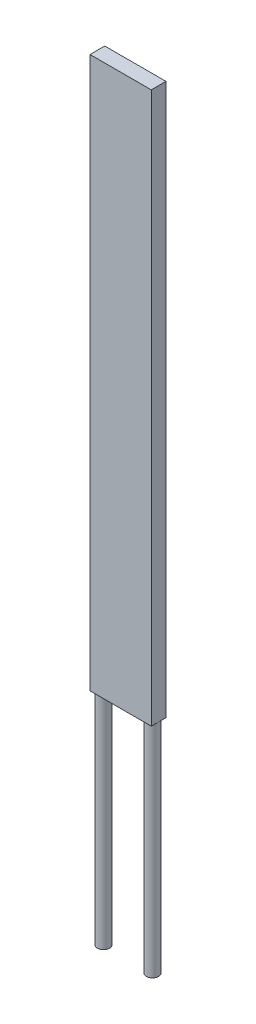
ISO-10303-21;
HEADER;
FILE_DESCRIPTION(('STEP AP214'),'2;1');
FILE_NAME('part.step','',(''),(''),'','','');
FILE_SCHEMA(('AUTOMOTIVE_DESIGN { 1 0 10303 214 1 1 1 1 }'));
ENDSEC;
DATA;
#1=APPLICATION_CONTEXT('core data for automotive mechanical design processes');
#2=APPLICATION_PROTOCOL_DEFINITION('international standard','automotive_design',2000,#1);
#3=PRODUCT_CONTEXT('',#1,'mechanical');
#4=PRODUCT('Part','Part','',(#3));
#5=PRODUCT_RELATED_PRODUCT_CATEGORY('part','',(#4));
#6=PRODUCT_DEFINITION_FORMATION('','',#4);
#7=PRODUCT_DEFINITION_CONTEXT('part definition',#1,'design');
#8=PRODUCT_DEFINITION('design','',#6,#7);
#9=PRODUCT_DEFINITION_SHAPE('','',#8);
#10=(LENGTH_UNIT() NAMED_UNIT(*) SI_UNIT(.MILLI.,.METRE.));
#11=(NAMED_UNIT(*) PLANE_ANGLE_UNIT() SI_UNIT($,.RADIAN.));
#12=(NAMED_UNIT(*) SI_UNIT($,.STERADIAN.) SOLID_ANGLE_UNIT());
#13=UNCERTAINTY_MEASURE_WITH_UNIT(LENGTH_MEASURE(1.E-05),#10,'distance_accuracy_value','');
#14=(GEOMETRIC_REPRESENTATION_CONTEXT(3) GLOBAL_UNCERTAINTY_ASSIGNED_CONTEXT((#13)) GLOBAL_UNIT_ASSIGNED_CONTEXT((#10,
#11,#12)) REPRESENTATION_CONTEXT('',''));
#15=CARTESIAN_POINT('',(0.,0.,0.));
#16=DIRECTION('',(0.,0.,1.));
#17=DIRECTION('',(1.,0.,0.));
#18=AXIS2_PLACEMENT_3D('',#15,#16,#17);
#19=CARTESIAN_POINT('',(0.,0.,0.));
#20=DIRECTION('',(0.,1.,0.));
#21=DIRECTION('',(0.,0.,1.));
#22=AXIS2_PLACEMENT_3D('',#19,#20,#21);
#23=PLANE('',#22);
#24=CARTESIAN_POINT('',(0.,0.,0.));
#25=DIRECTION('',(0.,1.,0.));
#26=DIRECTION('',(0.,0.,1.));
#27=AXIS2_PLACEMENT_3D('',#24,#25,#26);
#28=CIRCLE('',#27,3.175);
#29=CARTESIAN_POINT('',(0.,0.,3.175));
#30=VERTEX_POINT('',#29);
#31=EDGE_CURVE('E52',#30,#30,#28,.T.);
#32=ORIENTED_EDGE('',*,*,#31,.F.);
#33=EDGE_LOOP('',(#32));
#34=FACE_BOUND('',#33,.T.);
#35=ADVANCED_FACE('F45',(#34),#23,.F.);
#36=CARTESIAN_POINT('',(0.,0.,0.));
#37=DIRECTION('',(0.,1.,0.));
#38=DIRECTION('',(0.,0.,1.));
#39=AXIS2_PLACEMENT_3D('',#36,#37,#38);
#40=CYLINDRICAL_SURFACE('',#39,3.175);
#41=CARTESIAN_POINT('',(0.,114.3,0.));
#42=DIRECTION('',(0.,1.,0.));
#43=DIRECTION('',(0.,0.,1.));
#44=AXIS2_PLACEMENT_3D('',#41,#42,#43);
#45=CIRCLE('',#44,3.175);
#46=CARTESIAN_POINT('',(-3.175,114.3,0.));
#47=VERTEX_POINT('',#46);
#48=EDGE_CURVE('E12',#47,#47,#45,.T.);
#49=ORIENTED_EDGE('',*,*,#48,.F.);
#50=EDGE_LOOP('',(#49));
#51=FACE_BOUND('',#50,.T.);
#52=ORIENTED_EDGE('',*,*,#31,.T.);
#53=EDGE_LOOP('',(#52));
#54=FACE_BOUND('',#53,.T.);
#55=ADVANCED_FACE('F132',(#51,#54),#40,.T.);
#56=CARTESIAN_POINT('',(-3.175,114.3,3.81));
#57=DIRECTION('',(0.,1.,0.));
#58=DIRECTION('',(0.,0.,1.));
#59=AXIS2_PLACEMENT_3D('',#56,#57,#58);
#60=PLANE('',#59);
#61=CARTESIAN_POINT('',(25.4,114.3,0.));
#62=DIRECTION('',(0.,-1.,0.));
#63=DIRECTION('',(0.,0.,-1.));
#64=AXIS2_PLACEMENT_3D('',#61,#62,#63);
#65=CIRCLE('',#64,3.175);
#66=CARTESIAN_POINT('',(28.575,114.3,0.));
#67=VERTEX_POINT('',#66);
#68=EDGE_CURVE('E95',#67,#67,#65,.T.);
#69=ORIENTED_EDGE('',*,*,#68,.F.);
#70=DIRECTION('',(0.,0.,-1.));
#71=VECTOR('',#70,1.);
#72=CARTESIAN_POINT('',(28.575,114.3,3.81));
#73=LINE('',#72,#71);
#74=CARTESIAN_POINT('',(28.575,114.3,3.81));
#75=VERTEX_POINT('',#74);
#76=EDGE_CURVE('E125',#75,#67,#73,.T.);
#77=ORIENTED_EDGE('',*,*,#76,.F.);
#78=DIRECTION('',(1.,0.,0.));
#79=VECTOR('',#78,1.);
#80=CARTESIAN_POINT('',(-3.175,114.3,3.81));
#81=LINE('',#80,#79);
#82=CARTESIAN_POINT('',(-3.175,114.3,3.81));
#83=VERTEX_POINT('',#82);
#84=EDGE_CURVE('E106',#83,#75,#81,.T.);
#85=ORIENTED_EDGE('',*,*,#84,.F.);
#86=DIRECTION('',(0.,0.,-1.));
#87=VECTOR('',#86,1.);
#88=CARTESIAN_POINT('',(-3.175,114.3,3.81));
#89=LINE('',#88,#87);
#90=EDGE_CURVE('E129',#83,#47,#89,.T.);
#91=ORIENTED_EDGE('',*,*,#90,.T.);
#92=ORIENTED_EDGE('',*,*,#48,.T.);
#93=CARTESIAN_POINT('',(-3.175,114.3,-3.81));
#94=VERTEX_POINT('',#93);
#95=EDGE_CURVE('E128',#47,#94,#89,.T.);
#96=ORIENTED_EDGE('',*,*,#95,.T.);
#97=DIRECTION('',(1.,0.,0.));
#98=VECTOR('',#97,1.);
#99=CARTESIAN_POINT('',(-3.175,114.3,-3.81));
#100=LINE('',#99,#98);
#101=CARTESIAN_POINT('',(28.575,114.3,-3.81));
#102=VERTEX_POINT('',#101);
#103=EDGE_CURVE('E98',#94,#102,#100,.T.);
#104=ORIENTED_EDGE('',*,*,#103,.T.);
#105=EDGE_CURVE('E124',#67,#102,#73,.T.);
#106=ORIENTED_EDGE('',*,*,#105,.F.);
#107=EDGE_LOOP('',(#69,#77,#85,#91,#92,#96,#104,#106));
#108=FACE_BOUND('',#107,.T.);
#109=ADVANCED_FACE('F134',(#108),#60,.F.);
#110=CARTESIAN_POINT('',(-3.175,114.3,3.81));
#111=DIRECTION('',(1.,0.,0.));
#112=DIRECTION('',(0.,0.,-1.));
#113=AXIS2_PLACEMENT_3D('',#110,#111,#112);
#114=PLANE('',#113);
#115=DIRECTION('',(0.,-1.,0.));
#116=VECTOR('',#115,1.);
#117=CARTESIAN_POINT('',(-3.175,114.3,-3.81));
#118=LINE('',#117,#116);
#119=CARTESIAN_POINT('',(-3.175,400.,-3.81));
#120=VERTEX_POINT('',#119);
#121=EDGE_CURVE('E94',#120,#94,#118,.T.);
#122=ORIENTED_EDGE('',*,*,#121,.T.);
#123=ORIENTED_EDGE('',*,*,#95,.F.);
#124=ORIENTED_EDGE('',*,*,#90,.F.);
#125=DIRECTION('',(0.,-1.,0.));
#126=VECTOR('',#125,1.);
#127=CARTESIAN_POINT('',(-3.175,114.3,3.81));
#128=LINE('',#127,#126);
#129=CARTESIAN_POINT('',(-3.175,400.,3.81));
#130=VERTEX_POINT('',#129);
#131=EDGE_CURVE('E103',#130,#83,#128,.T.);
#132=ORIENTED_EDGE('',*,*,#131,.F.);
#133=DIRECTION('',(0.,0.,-1.));
#134=VECTOR('',#133,1.);
#135=CARTESIAN_POINT('',(-3.175,400.,3.81));
#136=LINE('',#135,#134);
#137=EDGE_CURVE('E112',#130,#120,#136,.T.);
#138=ORIENTED_EDGE('',*,*,#137,.T.);
#139=EDGE_LOOP('',(#122,#123,#124,#132,#138));
#140=FACE_BOUND('',#139,.T.);
#141=ADVANCED_FACE('F139',(#140),#114,.F.);
#142=CARTESIAN_POINT('',(28.575,114.3,3.81));
#143=DIRECTION('',(-1.,0.,0.));
#144=DIRECTION('',(0.,0.,1.));
#145=AXIS2_PLACEMENT_3D('',#142,#143,#144);
#146=PLANE('',#145);
#147=DIRECTION('',(0.,1.,0.));
#148=VECTOR('',#147,1.);
#149=CARTESIAN_POINT('',(28.575,114.3,-3.81));
#150=LINE('',#149,#148);
#151=CARTESIAN_POINT('',(28.575,400.,-3.81));
#152=VERTEX_POINT('',#151);
#153=EDGE_CURVE('E116',#102,#152,#150,.T.);
#154=ORIENTED_EDGE('',*,*,#153,.T.);
#155=DIRECTION('',(0.,0.,-1.));
#156=VECTOR('',#155,1.);
#157=CARTESIAN_POINT('',(28.575,400.,3.81));
#158=LINE('',#157,#156);
#159=CARTESIAN_POINT('',(28.575,400.,3.81));
#160=VERTEX_POINT('',#159);
#161=EDGE_CURVE('E121',#160,#152,#158,.T.);
#162=ORIENTED_EDGE('',*,*,#161,.F.);
#163=DIRECTION('',(0.,1.,0.));
#164=VECTOR('',#163,1.);
#165=CARTESIAN_POINT('',(28.575,114.3,3.81));
#166=LINE('',#165,#164);
#167=EDGE_CURVE('E109',#75,#160,#166,.T.);
#168=ORIENTED_EDGE('',*,*,#167,.F.);
#169=ORIENTED_EDGE('',*,*,#76,.T.);
#170=ORIENTED_EDGE('',*,*,#105,.T.);
#171=EDGE_LOOP('',(#154,#162,#168,#169,#170));
#172=FACE_BOUND('',#171,.T.);
#173=ADVANCED_FACE('F144',(#172),#146,.F.);
#174=CARTESIAN_POINT('',(-3.175,400.,3.81));
#175=DIRECTION('',(0.,-1.,0.));
#176=DIRECTION('',(0.,0.,-1.));
#177=AXIS2_PLACEMENT_3D('',#174,#175,#176);
#178=PLANE('',#177);
#179=DIRECTION('',(-1.,0.,0.));
#180=VECTOR('',#179,1.);
#181=CARTESIAN_POINT('',(-3.175,400.,-3.81));
#182=LINE('',#181,#180);
#183=EDGE_CURVE('E107',#152,#120,#182,.T.);
#184=ORIENTED_EDGE('',*,*,#183,.T.);
#185=ORIENTED_EDGE('',*,*,#137,.F.);
#186=DIRECTION('',(-1.,0.,0.));
#187=VECTOR('',#186,1.);
#188=CARTESIAN_POINT('',(-3.175,400.,3.81));
#189=LINE('',#188,#187);
#190=EDGE_CURVE('E111',#160,#130,#189,.T.);
#191=ORIENTED_EDGE('',*,*,#190,.F.);
#192=ORIENTED_EDGE('',*,*,#161,.T.);
#193=EDGE_LOOP('',(#184,#185,#191,#192));
#194=FACE_BOUND('',#193,.T.);
#195=ADVANCED_FACE('F149',(#194),#178,.F.);
#196=CARTESIAN_POINT('',(0.,0.,3.81));
#197=DIRECTION('',(0.,0.,-1.));
#198=DIRECTION('',(-1.,0.,0.));
#199=AXIS2_PLACEMENT_3D('',#196,#197,#198);
#200=PLANE('',#199);
#201=ORIENTED_EDGE('',*,*,#131,.T.);
#202=ORIENTED_EDGE('',*,*,#84,.T.);
#203=ORIENTED_EDGE('',*,*,#167,.T.);
#204=ORIENTED_EDGE('',*,*,#190,.T.);
#205=EDGE_LOOP('',(#201,#202,#203,#204));
#206=FACE_BOUND('',#205,.T.);
#207=ADVANCED_FACE('F153',(#206),#200,.F.);
#208=CARTESIAN_POINT('',(0.,0.,-3.81));
#209=DIRECTION('',(0.,0.,-1.));
#210=DIRECTION('',(-1.,0.,0.));
#211=AXIS2_PLACEMENT_3D('',#208,#209,#210);
#212=PLANE('',#211);
#213=ORIENTED_EDGE('',*,*,#121,.F.);
#214=ORIENTED_EDGE('',*,*,#183,.F.);
#215=ORIENTED_EDGE('',*,*,#153,.F.);
#216=ORIENTED_EDGE('',*,*,#103,.F.);
#217=EDGE_LOOP('',(#213,#214,#215,#216));
#218=FACE_BOUND('',#217,.T.);
#219=ADVANCED_FACE('F155',(#218),#212,.T.);
#220=CARTESIAN_POINT('',(25.4,0.,0.));
#221=DIRECTION('',(0.,-1.,0.));
#222=DIRECTION('',(0.,0.,-1.));
#223=AXIS2_PLACEMENT_3D('',#220,#221,#222);
#224=PLANE('',#223);
#225=CARTESIAN_POINT('',(25.4,0.,0.));
#226=DIRECTION('',(0.,-1.,0.));
#227=DIRECTION('',(0.,0.,-1.));
#228=AXIS2_PLACEMENT_3D('',#225,#226,#227);
#229=CIRCLE('',#228,3.175);
#230=CARTESIAN_POINT('',(25.4,0.,-3.175));
#231=VERTEX_POINT('',#230);
#232=EDGE_CURVE('E91',#231,#231,#229,.T.);
#233=ORIENTED_EDGE('',*,*,#232,.T.);
#234=EDGE_LOOP('',(#233));
#235=FACE_BOUND('',#234,.T.);
#236=ADVANCED_FACE('F92',(#235),#224,.T.);
#237=CARTESIAN_POINT('',(25.4,114.3,0.));
#238=DIRECTION('',(0.,-1.,0.));
#239=DIRECTION('',(1.,0.,0.));
#240=AXIS2_PLACEMENT_3D('',#237,#238,#239);
#241=CYLINDRICAL_SURFACE('',#240,3.175);
#242=ORIENTED_EDGE('',*,*,#232,.F.);
#243=EDGE_LOOP('',(#242));
#244=FACE_BOUND('',#243,.T.);
#245=ORIENTED_EDGE('',*,*,#68,.T.);
#246=EDGE_LOOP('',(#245));
#247=FACE_BOUND('',#246,.T.);
#248=ADVANCED_FACE('F159',(#244,#247),#241,.T.);
#249=CLOSED_SHELL('',(#35,#55,#109,#141,#173,#195,#207,#219,#236,#248));
#250=MANIFOLD_SOLID_BREP('B2',#249);
#251=ADVANCED_BREP_SHAPE_REPRESENTATION('',(#18,#250),#14);
#252=SHAPE_DEFINITION_REPRESENTATION(#9,#251);
ENDSEC;
END-ISO-10303-21;
